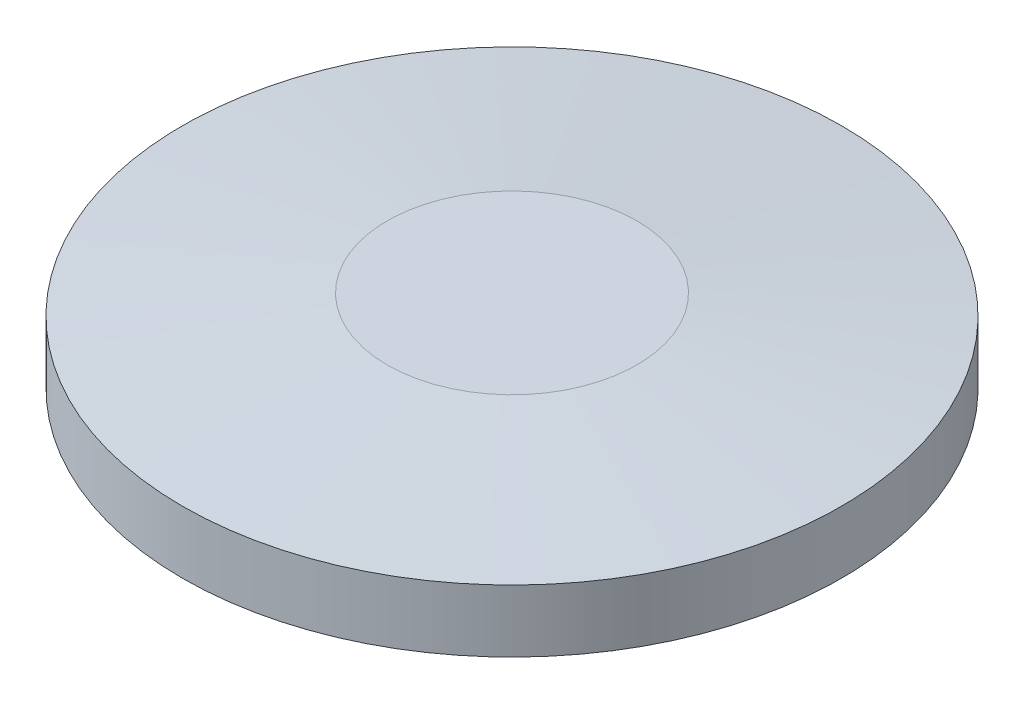
ISO-10303-21;
HEADER;
FILE_DESCRIPTION(('STEP AP214'),'2;1');
FILE_NAME('part.step','',(''),(''),'','','');
FILE_SCHEMA(('AUTOMOTIVE_DESIGN { 1 0 10303 214 1 1 1 1 }'));
ENDSEC;
DATA;
#1=APPLICATION_CONTEXT('core data for automotive mechanical design processes');
#2=APPLICATION_PROTOCOL_DEFINITION('international standard','automotive_design',2000,#1);
#3=PRODUCT_CONTEXT('',#1,'mechanical');
#4=PRODUCT('Part','Part','',(#3));
#5=PRODUCT_RELATED_PRODUCT_CATEGORY('part','',(#4));
#6=PRODUCT_DEFINITION_FORMATION('','',#4);
#7=PRODUCT_DEFINITION_CONTEXT('part definition',#1,'design');
#8=PRODUCT_DEFINITION('design','',#6,#7);
#9=PRODUCT_DEFINITION_SHAPE('','',#8);
#10=(LENGTH_UNIT() NAMED_UNIT(*) SI_UNIT(.MILLI.,.METRE.));
#11=(NAMED_UNIT(*) PLANE_ANGLE_UNIT() SI_UNIT($,.RADIAN.));
#12=(NAMED_UNIT(*) SI_UNIT($,.STERADIAN.) SOLID_ANGLE_UNIT());
#13=UNCERTAINTY_MEASURE_WITH_UNIT(LENGTH_MEASURE(1.E-05),#10,'distance_accuracy_value','');
#14=(GEOMETRIC_REPRESENTATION_CONTEXT(3) GLOBAL_UNCERTAINTY_ASSIGNED_CONTEXT((#13)) GLOBAL_UNIT_ASSIGNED_CONTEXT((#10,
#11,#12)) REPRESENTATION_CONTEXT('',''));
#15=CARTESIAN_POINT('',(0.,0.,0.));
#16=DIRECTION('',(0.,0.,1.));
#17=DIRECTION('',(1.,0.,0.));
#18=AXIS2_PLACEMENT_3D('',#15,#16,#17);
#19=CARTESIAN_POINT('',(0.,0.249999999999999,-18.4));
#20=DIRECTION('',(0.,-1.,0.));
#21=DIRECTION('',(0.,0.,-1.));
#22=AXIS2_PLACEMENT_3D('',#19,#20,#21);
#23=PLANE('',#22);
#24=CARTESIAN_POINT('',(0.,0.25,0.));
#25=DIRECTION('',(0.,-1.,0.));
#26=DIRECTION('',(0.,0.,-1.));
#27=AXIS2_PLACEMENT_3D('',#24,#25,#26);
#28=CIRCLE('',#27,18.4);
#29=CARTESIAN_POINT('',(0.,0.25,-18.4));
#30=VERTEX_POINT('',#29);
#31=EDGE_CURVE('E10',#30,#30,#28,.T.);
#32=ORIENTED_EDGE('',*,*,#31,.T.);
#33=EDGE_LOOP('',(#32));
#34=FACE_BOUND('',#33,.T.);
#35=ADVANCED_FACE('F38',(#34),#23,.T.);
#36=CARTESIAN_POINT('',(0.,0.,0.));
#37=DIRECTION('',(0.,-1.,0.));
#38=DIRECTION('',(0.,0.,-1.));
#39=AXIS2_PLACEMENT_3D('',#36,#37,#38);
#40=CYLINDRICAL_SURFACE('',#39,18.4);
#41=CARTESIAN_POINT('',(0.,-0.25,0.));
#42=DIRECTION('',(0.,-1.,0.));
#43=DIRECTION('',(0.,0.,-1.));
#44=AXIS2_PLACEMENT_3D('',#41,#42,#43);
#45=CIRCLE('',#44,18.4);
#46=CARTESIAN_POINT('',(0.,-0.25,-18.4));
#47=VERTEX_POINT('',#46);
#48=EDGE_CURVE('E45',#47,#47,#45,.T.);
#49=ORIENTED_EDGE('',*,*,#48,.T.);
#50=EDGE_LOOP('',(#49));
#51=FACE_BOUND('',#50,.T.);
#52=ORIENTED_EDGE('',*,*,#31,.F.);
#53=EDGE_LOOP('',(#52));
#54=FACE_BOUND('',#53,.T.);
#55=ADVANCED_FACE('F78',(#51,#54),#40,.F.);
#56=CARTESIAN_POINT('',(0.,-0.25,-19.8));
#57=DIRECTION('',(0.,-1.,0.));
#58=DIRECTION('',(0.,0.,-1.));
#59=AXIS2_PLACEMENT_3D('',#56,#57,#58);
#60=PLANE('',#59);
#61=CARTESIAN_POINT('',(0.,-0.25,0.));
#62=DIRECTION('',(0.,-1.,0.));
#63=DIRECTION('',(0.,0.,-1.));
#64=AXIS2_PLACEMENT_3D('',#61,#62,#63);
#65=CIRCLE('',#64,19.8);
#66=CARTESIAN_POINT('',(0.,-0.25,-19.8));
#67=VERTEX_POINT('',#66);
#68=EDGE_CURVE('E51',#67,#67,#65,.T.);
#69=ORIENTED_EDGE('',*,*,#68,.T.);
#70=EDGE_LOOP('',(#69));
#71=FACE_BOUND('',#70,.T.);
#72=ORIENTED_EDGE('',*,*,#48,.F.);
#73=EDGE_LOOP('',(#72));
#74=FACE_BOUND('',#73,.T.);
#75=ADVANCED_FACE('F81',(#71,#74),#60,.T.);
#76=CARTESIAN_POINT('',(0.,0.,0.));
#77=DIRECTION('',(0.,-1.,0.));
#78=DIRECTION('',(0.,0.,-1.));
#79=AXIS2_PLACEMENT_3D('',#76,#77,#78);
#80=CYLINDRICAL_SURFACE('',#79,19.8);
#81=CARTESIAN_POINT('',(0.,3.5,0.));
#82=DIRECTION('',(0.,-1.,0.));
#83=DIRECTION('',(0.,0.,-1.));
#84=AXIS2_PLACEMENT_3D('',#81,#82,#83);
#85=CIRCLE('',#84,19.8);
#86=CARTESIAN_POINT('',(0.,3.5,-19.8));
#87=VERTEX_POINT('',#86);
#88=EDGE_CURVE('E57',#87,#87,#85,.T.);
#89=ORIENTED_EDGE('',*,*,#88,.T.);
#90=EDGE_LOOP('',(#89));
#91=FACE_BOUND('',#90,.T.);
#92=ORIENTED_EDGE('',*,*,#68,.F.);
#93=EDGE_LOOP('',(#92));
#94=FACE_BOUND('',#93,.T.);
#95=ADVANCED_FACE('F75',(#91,#94),#80,.T.);
#96=CARTESIAN_POINT('',(0.,3.5,0.));
#97=DIRECTION('',(0.,-1.,0.));
#98=DIRECTION('',(0.,0.,-1.));
#99=AXIS2_PLACEMENT_3D('',#96,#97,#98);
#100=CONICAL_SURFACE('',#99,19.8,1.47354312854333);
#101=CARTESIAN_POINT('',(0.,4.7,0.));
#102=DIRECTION('',(0.,-1.,0.));
#103=DIRECTION('',(0.,0.,-1.));
#104=AXIS2_PLACEMENT_3D('',#101,#102,#103);
#105=CIRCLE('',#104,7.5);
#106=CARTESIAN_POINT('',(0.,4.7,-7.5));
#107=VERTEX_POINT('',#106);
#108=EDGE_CURVE('E62',#107,#107,#105,.T.);
#109=ORIENTED_EDGE('',*,*,#108,.T.);
#110=EDGE_LOOP('',(#109));
#111=FACE_BOUND('',#110,.T.);
#112=ORIENTED_EDGE('',*,*,#88,.F.);
#113=EDGE_LOOP('',(#112));
#114=FACE_BOUND('',#113,.T.);
#115=ADVANCED_FACE('F66',(#111,#114),#100,.T.);
#116=CARTESIAN_POINT('',(0.,4.7,-7.5));
#117=DIRECTION('',(0.,1.,0.));
#118=DIRECTION('',(0.,0.,1.));
#119=AXIS2_PLACEMENT_3D('',#116,#117,#118);
#120=PLANE('',#119);
#121=ORIENTED_EDGE('',*,*,#108,.F.);
#122=EDGE_LOOP('',(#121));
#123=FACE_BOUND('',#122,.T.);
#124=ADVANCED_FACE('F69',(#123),#120,.T.);
#125=CLOSED_SHELL('',(#35,#55,#75,#95,#115,#124));
#126=MANIFOLD_SOLID_BREP('B2',#125);
#127=ADVANCED_BREP_SHAPE_REPRESENTATION('',(#18,#126),#14);
#128=SHAPE_DEFINITION_REPRESENTATION(#9,#127);
ENDSEC;
END-ISO-10303-21;
